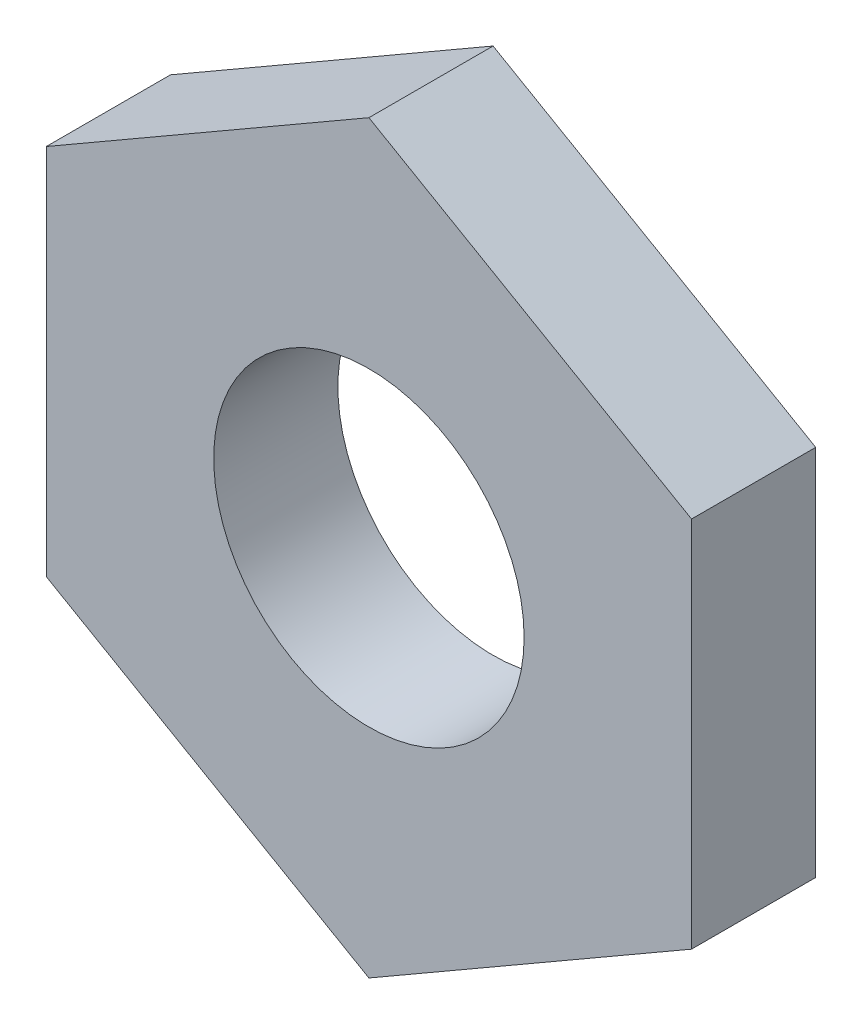
ISO-10303-21;
HEADER;
FILE_DESCRIPTION(('STEP AP214'),'2;1');
FILE_NAME('part.step','',(''),(''),'','','');
FILE_SCHEMA(('AUTOMOTIVE_DESIGN { 1 0 10303 214 1 1 1 1 }'));
ENDSEC;
DATA;
#1=APPLICATION_CONTEXT('core data for automotive mechanical design processes');
#2=APPLICATION_PROTOCOL_DEFINITION('international standard','automotive_design',2000,#1);
#3=PRODUCT_CONTEXT('',#1,'mechanical');
#4=PRODUCT('Part','Part','',(#3));
#5=PRODUCT_RELATED_PRODUCT_CATEGORY('part','',(#4));
#6=PRODUCT_DEFINITION_FORMATION('','',#4);
#7=PRODUCT_DEFINITION_CONTEXT('part definition',#1,'design');
#8=PRODUCT_DEFINITION('design','',#6,#7);
#9=PRODUCT_DEFINITION_SHAPE('','',#8);
#10=(LENGTH_UNIT() NAMED_UNIT(*) SI_UNIT(.MILLI.,.METRE.));
#11=(NAMED_UNIT(*) PLANE_ANGLE_UNIT() SI_UNIT($,.RADIAN.));
#12=(NAMED_UNIT(*) SI_UNIT($,.STERADIAN.) SOLID_ANGLE_UNIT());
#13=UNCERTAINTY_MEASURE_WITH_UNIT(LENGTH_MEASURE(1.E-05),#10,'distance_accuracy_value','');
#14=(GEOMETRIC_REPRESENTATION_CONTEXT(3) GLOBAL_UNCERTAINTY_ASSIGNED_CONTEXT((#13)) GLOBAL_UNIT_ASSIGNED_CONTEXT((#10,
#11,#12)) REPRESENTATION_CONTEXT('',''));
#15=CARTESIAN_POINT('',(0.,0.,0.));
#16=DIRECTION('',(0.,0.,1.));
#17=DIRECTION('',(1.,0.,0.));
#18=AXIS2_PLACEMENT_3D('',#15,#16,#17);
#19=CARTESIAN_POINT('',(1.29903810567666,2.25,1.));
#20=DIRECTION('',(-0.5,-0.866025403784439,0.));
#21=DIRECTION('',(0.866025403784439,-0.5,0.));
#22=AXIS2_PLACEMENT_3D('',#19,#20,#21);
#23=PLANE('',#22);
#24=DIRECTION('',(-0.866025403784439,0.5,0.));
#25=VECTOR('',#24,1.);
#26=CARTESIAN_POINT('',(1.29903810567666,2.25,0.));
#27=LINE('',#26,#25);
#28=CARTESIAN_POINT('',(2.59807621135332,1.5,0.));
#29=VERTEX_POINT('',#28);
#30=CARTESIAN_POINT('',(0.,3.,0.));
#31=VERTEX_POINT('',#30);
#32=EDGE_CURVE('E139',#29,#31,#27,.T.);
#33=ORIENTED_EDGE('',*,*,#32,.T.);
#34=DIRECTION('',(0.,0.,-1.));
#35=VECTOR('',#34,1.);
#36=CARTESIAN_POINT('',(0.,3.,1.));
#37=LINE('',#36,#35);
#38=CARTESIAN_POINT('',(0.,3.,1.));
#39=VERTEX_POINT('',#38);
#40=EDGE_CURVE('E11',#39,#31,#37,.T.);
#41=ORIENTED_EDGE('',*,*,#40,.F.);
#42=DIRECTION('',(-0.866025403784439,0.5,0.));
#43=VECTOR('',#42,1.);
#44=CARTESIAN_POINT('',(1.29903810567666,2.25,1.));
#45=LINE('',#44,#43);
#46=CARTESIAN_POINT('',(2.59807621135332,1.5,1.));
#47=VERTEX_POINT('',#46);
#48=EDGE_CURVE('E159',#47,#39,#45,.T.);
#49=ORIENTED_EDGE('',*,*,#48,.F.);
#50=DIRECTION('',(0.,0.,-1.));
#51=VECTOR('',#50,1.);
#52=CARTESIAN_POINT('',(2.59807621135332,1.5,1.));
#53=LINE('',#52,#51);
#54=EDGE_CURVE('E138',#47,#29,#53,.T.);
#55=ORIENTED_EDGE('',*,*,#54,.T.);
#56=EDGE_LOOP('',(#33,#41,#49,#55));
#57=FACE_BOUND('',#56,.T.);
#58=ADVANCED_FACE('F45',(#57),#23,.F.);
#59=CARTESIAN_POINT('',(-1.29903810567666,2.25,1.));
#60=DIRECTION('',(0.5,-0.866025403784439,0.));
#61=DIRECTION('',(0.866025403784439,0.5,0.));
#62=AXIS2_PLACEMENT_3D('',#59,#60,#61);
#63=PLANE('',#62);
#64=DIRECTION('',(-0.866025403784439,-0.5,0.));
#65=VECTOR('',#64,1.);
#66=CARTESIAN_POINT('',(-1.29903810567666,2.25,0.));
#67=LINE('',#66,#65);
#68=CARTESIAN_POINT('',(-2.59807621135332,1.5,0.));
#69=VERTEX_POINT('',#68);
#70=EDGE_CURVE('E143',#31,#69,#67,.T.);
#71=ORIENTED_EDGE('',*,*,#70,.T.);
#72=DIRECTION('',(0.,0.,-1.));
#73=VECTOR('',#72,1.);
#74=CARTESIAN_POINT('',(-2.59807621135332,1.5,1.));
#75=LINE('',#74,#73);
#76=CARTESIAN_POINT('',(-2.59807621135332,1.5,1.));
#77=VERTEX_POINT('',#76);
#78=EDGE_CURVE('E54',#77,#69,#75,.T.);
#79=ORIENTED_EDGE('',*,*,#78,.F.);
#80=DIRECTION('',(-0.866025403784439,-0.5,0.));
#81=VECTOR('',#80,1.);
#82=CARTESIAN_POINT('',(-1.29903810567666,2.25,1.));
#83=LINE('',#82,#81);
#84=EDGE_CURVE('E99',#39,#77,#83,.T.);
#85=ORIENTED_EDGE('',*,*,#84,.F.);
#86=ORIENTED_EDGE('',*,*,#40,.T.);
#87=EDGE_LOOP('',(#71,#79,#85,#86));
#88=FACE_BOUND('',#87,.T.);
#89=ADVANCED_FACE('F189',(#88),#63,.F.);
#90=CARTESIAN_POINT('',(-2.59807621135332,0.,1.));
#91=DIRECTION('',(1.,0.,0.));
#92=DIRECTION('',(0.,0.,-1.));
#93=AXIS2_PLACEMENT_3D('',#90,#91,#92);
#94=PLANE('',#93);
#95=DIRECTION('',(0.,-1.,0.));
#96=VECTOR('',#95,1.);
#97=CARTESIAN_POINT('',(-2.59807621135332,0.,0.));
#98=LINE('',#97,#96);
#99=CARTESIAN_POINT('',(-2.59807621135332,-1.5,0.));
#100=VERTEX_POINT('',#99);
#101=EDGE_CURVE('E146',#69,#100,#98,.T.);
#102=ORIENTED_EDGE('',*,*,#101,.T.);
#103=DIRECTION('',(0.,0.,-1.));
#104=VECTOR('',#103,1.);
#105=CARTESIAN_POINT('',(-2.59807621135332,-1.5,1.));
#106=LINE('',#105,#104);
#107=CARTESIAN_POINT('',(-2.59807621135332,-1.5,1.));
#108=VERTEX_POINT('',#107);
#109=EDGE_CURVE('E124',#108,#100,#106,.T.);
#110=ORIENTED_EDGE('',*,*,#109,.F.);
#111=DIRECTION('',(0.,-1.,0.));
#112=VECTOR('',#111,1.);
#113=CARTESIAN_POINT('',(-2.59807621135332,0.,1.));
#114=LINE('',#113,#112);
#115=EDGE_CURVE('E113',#77,#108,#114,.T.);
#116=ORIENTED_EDGE('',*,*,#115,.F.);
#117=ORIENTED_EDGE('',*,*,#78,.T.);
#118=EDGE_LOOP('',(#102,#110,#116,#117));
#119=FACE_BOUND('',#118,.T.);
#120=ADVANCED_FACE('F169',(#119),#94,.F.);
#121=CARTESIAN_POINT('',(-1.29903810567666,-2.25,1.));
#122=DIRECTION('',(0.5,0.866025403784438,0.));
#123=DIRECTION('',(-0.866025403784438,0.5,0.));
#124=AXIS2_PLACEMENT_3D('',#121,#122,#123);
#125=PLANE('',#124);
#126=DIRECTION('',(0.866025403784438,-0.5,0.));
#127=VECTOR('',#126,1.);
#128=CARTESIAN_POINT('',(-1.29903810567666,-2.25,0.));
#129=LINE('',#128,#127);
#130=CARTESIAN_POINT('',(0.,-3.,0.));
#131=VERTEX_POINT('',#130);
#132=EDGE_CURVE('E122',#100,#131,#129,.T.);
#133=ORIENTED_EDGE('',*,*,#132,.T.);
#134=DIRECTION('',(0.,0.,-1.));
#135=VECTOR('',#134,1.);
#136=CARTESIAN_POINT('',(0.,-3.,1.));
#137=LINE('',#136,#135);
#138=CARTESIAN_POINT('',(0.,-3.,1.));
#139=VERTEX_POINT('',#138);
#140=EDGE_CURVE('E119',#139,#131,#137,.T.);
#141=ORIENTED_EDGE('',*,*,#140,.F.);
#142=DIRECTION('',(0.866025403784438,-0.5,0.));
#143=VECTOR('',#142,1.);
#144=CARTESIAN_POINT('',(-1.29903810567666,-2.25,1.));
#145=LINE('',#144,#143);
#146=EDGE_CURVE('E106',#108,#139,#145,.T.);
#147=ORIENTED_EDGE('',*,*,#146,.F.);
#148=ORIENTED_EDGE('',*,*,#109,.T.);
#149=EDGE_LOOP('',(#133,#141,#147,#148));
#150=FACE_BOUND('',#149,.T.);
#151=ADVANCED_FACE('F120',(#150),#125,.F.);
#152=CARTESIAN_POINT('',(1.29903810567666,-2.25,1.));
#153=DIRECTION('',(-0.5,0.866025403784439,0.));
#154=DIRECTION('',(-0.866025403784439,-0.5,0.));
#155=AXIS2_PLACEMENT_3D('',#152,#153,#154);
#156=PLANE('',#155);
#157=DIRECTION('',(0.866025403784439,0.5,0.));
#158=VECTOR('',#157,1.);
#159=CARTESIAN_POINT('',(1.29903810567666,-2.25,0.));
#160=LINE('',#159,#158);
#161=CARTESIAN_POINT('',(2.59807621135332,-1.5,0.));
#162=VERTEX_POINT('',#161);
#163=EDGE_CURVE('E85',#131,#162,#160,.T.);
#164=ORIENTED_EDGE('',*,*,#163,.T.);
#165=DIRECTION('',(0.,0.,-1.));
#166=VECTOR('',#165,1.);
#167=CARTESIAN_POINT('',(2.59807621135332,-1.5,1.));
#168=LINE('',#167,#166);
#169=CARTESIAN_POINT('',(2.59807621135332,-1.5,1.));
#170=VERTEX_POINT('',#169);
#171=EDGE_CURVE('E125',#170,#162,#168,.T.);
#172=ORIENTED_EDGE('',*,*,#171,.F.);
#173=DIRECTION('',(0.866025403784439,0.5,0.));
#174=VECTOR('',#173,1.);
#175=CARTESIAN_POINT('',(1.29903810567666,-2.25,1.));
#176=LINE('',#175,#174);
#177=EDGE_CURVE('E111',#139,#170,#176,.T.);
#178=ORIENTED_EDGE('',*,*,#177,.F.);
#179=ORIENTED_EDGE('',*,*,#140,.T.);
#180=EDGE_LOOP('',(#164,#172,#178,#179));
#181=FACE_BOUND('',#180,.T.);
#182=ADVANCED_FACE('F127',(#181),#156,.F.);
#183=CARTESIAN_POINT('',(2.59807621135332,0.,1.));
#184=DIRECTION('',(-1.,0.,0.));
#185=DIRECTION('',(0.,0.,1.));
#186=AXIS2_PLACEMENT_3D('',#183,#184,#185);
#187=PLANE('',#186);
#188=DIRECTION('',(0.,1.,0.));
#189=VECTOR('',#188,1.);
#190=CARTESIAN_POINT('',(2.59807621135332,0.,0.));
#191=LINE('',#190,#189);
#192=EDGE_CURVE('E91',#162,#29,#191,.T.);
#193=ORIENTED_EDGE('',*,*,#192,.T.);
#194=ORIENTED_EDGE('',*,*,#54,.F.);
#195=DIRECTION('',(0.,1.,0.));
#196=VECTOR('',#195,1.);
#197=CARTESIAN_POINT('',(2.59807621135332,0.,1.));
#198=LINE('',#197,#196);
#199=EDGE_CURVE('E62',#170,#47,#198,.T.);
#200=ORIENTED_EDGE('',*,*,#199,.F.);
#201=ORIENTED_EDGE('',*,*,#171,.T.);
#202=EDGE_LOOP('',(#193,#194,#200,#201));
#203=FACE_BOUND('',#202,.T.);
#204=ADVANCED_FACE('F177',(#203),#187,.F.);
#205=CARTESIAN_POINT('',(0.,0.,1.));
#206=DIRECTION('',(0.,0.,-1.));
#207=DIRECTION('',(-1.,0.,0.));
#208=AXIS2_PLACEMENT_3D('',#205,#206,#207);
#209=CYLINDRICAL_SURFACE('',#208,1.25);
#210=CARTESIAN_POINT('',(0.,0.,1.));
#211=DIRECTION('',(0.,0.,1.));
#212=DIRECTION('',(1.,0.,0.));
#213=AXIS2_PLACEMENT_3D('',#210,#211,#212);
#214=CIRCLE('',#213,1.25);
#215=CARTESIAN_POINT('',(1.25,0.,1.));
#216=VERTEX_POINT('',#215);
#217=EDGE_CURVE('E131',#216,#216,#214,.T.);
#218=ORIENTED_EDGE('',*,*,#217,.T.);
#219=EDGE_LOOP('',(#218));
#220=FACE_BOUND('',#219,.T.);
#221=CARTESIAN_POINT('',(0.,0.,0.));
#222=DIRECTION('',(0.,0.,1.));
#223=DIRECTION('',(1.,0.,0.));
#224=AXIS2_PLACEMENT_3D('',#221,#222,#223);
#225=CIRCLE('',#224,1.25);
#226=CARTESIAN_POINT('',(1.25,0.,0.));
#227=VERTEX_POINT('',#226);
#228=EDGE_CURVE('E155',#227,#227,#225,.T.);
#229=ORIENTED_EDGE('',*,*,#228,.F.);
#230=EDGE_LOOP('',(#229));
#231=FACE_BOUND('',#230,.T.);
#232=ADVANCED_FACE('F179',(#220,#231),#209,.F.);
#233=CARTESIAN_POINT('',(0.,0.,1.));
#234=DIRECTION('',(0.,0.,1.));
#235=DIRECTION('',(1.,0.,0.));
#236=AXIS2_PLACEMENT_3D('',#233,#234,#235);
#237=PLANE('',#236);
#238=ORIENTED_EDGE('',*,*,#48,.T.);
#239=ORIENTED_EDGE('',*,*,#84,.T.);
#240=ORIENTED_EDGE('',*,*,#115,.T.);
#241=ORIENTED_EDGE('',*,*,#146,.T.);
#242=ORIENTED_EDGE('',*,*,#177,.T.);
#243=ORIENTED_EDGE('',*,*,#199,.T.);
#244=EDGE_LOOP('',(#238,#239,#240,#241,#242,#243));
#245=FACE_BOUND('',#244,.T.);
#246=ORIENTED_EDGE('',*,*,#217,.F.);
#247=EDGE_LOOP('',(#246));
#248=FACE_BOUND('',#247,.T.);
#249=ADVANCED_FACE('F108',(#245,#248),#237,.T.);
#250=CARTESIAN_POINT('',(0.,0.,0.));
#251=DIRECTION('',(0.,0.,1.));
#252=DIRECTION('',(1.,0.,0.));
#253=AXIS2_PLACEMENT_3D('',#250,#251,#252);
#254=PLANE('',#253);
#255=ORIENTED_EDGE('',*,*,#32,.F.);
#256=ORIENTED_EDGE('',*,*,#192,.F.);
#257=ORIENTED_EDGE('',*,*,#163,.F.);
#258=ORIENTED_EDGE('',*,*,#132,.F.);
#259=ORIENTED_EDGE('',*,*,#101,.F.);
#260=ORIENTED_EDGE('',*,*,#70,.F.);
#261=EDGE_LOOP('',(#255,#256,#257,#258,#259,#260));
#262=FACE_BOUND('',#261,.T.);
#263=ORIENTED_EDGE('',*,*,#228,.T.);
#264=EDGE_LOOP('',(#263));
#265=FACE_BOUND('',#264,.T.);
#266=ADVANCED_FACE('F172',(#262,#265),#254,.F.);
#267=CLOSED_SHELL('',(#58,#89,#120,#151,#182,#204,#232,#249,#266));
#268=MANIFOLD_SOLID_BREP('B2',#267);
#269=ADVANCED_BREP_SHAPE_REPRESENTATION('',(#18,#268),#14);
#270=SHAPE_DEFINITION_REPRESENTATION(#9,#269);
ENDSEC;
END-ISO-10303-21;
